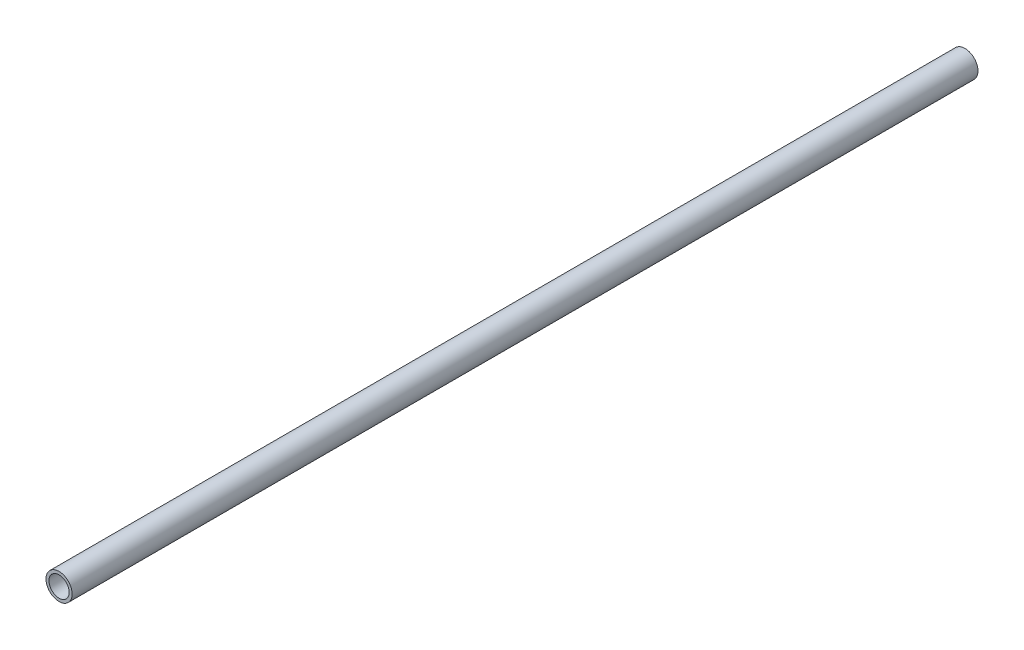
ISO-10303-21;
HEADER;
FILE_DESCRIPTION(('STEP AP214'),'2;1');
FILE_NAME('part.step','',(''),(''),'','','');
FILE_SCHEMA(('AUTOMOTIVE_DESIGN { 1 0 10303 214 1 1 1 1 }'));
ENDSEC;
DATA;
#1=APPLICATION_CONTEXT('core data for automotive mechanical design processes');
#2=APPLICATION_PROTOCOL_DEFINITION('international standard','automotive_design',2000,#1);
#3=PRODUCT_CONTEXT('',#1,'mechanical');
#4=PRODUCT('Part','Part','',(#3));
#5=PRODUCT_RELATED_PRODUCT_CATEGORY('part','',(#4));
#6=PRODUCT_DEFINITION_FORMATION('','',#4);
#7=PRODUCT_DEFINITION_CONTEXT('part definition',#1,'design');
#8=PRODUCT_DEFINITION('design','',#6,#7);
#9=PRODUCT_DEFINITION_SHAPE('','',#8);
#10=(LENGTH_UNIT() NAMED_UNIT(*) SI_UNIT(.MILLI.,.METRE.));
#11=(NAMED_UNIT(*) PLANE_ANGLE_UNIT() SI_UNIT($,.RADIAN.));
#12=(NAMED_UNIT(*) SI_UNIT($,.STERADIAN.) SOLID_ANGLE_UNIT());
#13=UNCERTAINTY_MEASURE_WITH_UNIT(LENGTH_MEASURE(1.E-05),#10,'distance_accuracy_value','');
#14=(GEOMETRIC_REPRESENTATION_CONTEXT(3) GLOBAL_UNCERTAINTY_ASSIGNED_CONTEXT((#13)) GLOBAL_UNIT_ASSIGNED_CONTEXT((#10,
#11,#12)) REPRESENTATION_CONTEXT('',''));
#15=CARTESIAN_POINT('',(0.,0.,0.));
#16=DIRECTION('',(0.,0.,1.));
#17=DIRECTION('',(1.,0.,0.));
#18=AXIS2_PLACEMENT_3D('',#15,#16,#17);
#19=CARTESIAN_POINT('',(0.,0.,165.1));
#20=DIRECTION('',(0.,0.,1.));
#21=DIRECTION('',(1.,0.,0.));
#22=AXIS2_PLACEMENT_3D('',#19,#20,#21);
#23=PLANE('',#22);
#24=CARTESIAN_POINT('',(0.,0.,165.1));
#25=DIRECTION('',(0.,0.,1.));
#26=DIRECTION('',(1.,0.,0.));
#27=AXIS2_PLACEMENT_3D('',#24,#25,#26);
#28=CIRCLE('',#27,4.7625);
#29=CARTESIAN_POINT('',(4.7625,0.,165.1));
#30=VERTEX_POINT('',#29);
#31=EDGE_CURVE('E10',#30,#30,#28,.T.);
#32=ORIENTED_EDGE('',*,*,#31,.T.);
#33=EDGE_LOOP('',(#32));
#34=FACE_BOUND('',#33,.T.);
#35=CARTESIAN_POINT('',(0.,0.,165.1));
#36=DIRECTION('',(0.,0.,1.));
#37=DIRECTION('',(1.,0.,0.));
#38=AXIS2_PLACEMENT_3D('',#35,#36,#37);
#39=CIRCLE('',#38,3.683);
#40=CARTESIAN_POINT('',(3.683,0.,165.1));
#41=VERTEX_POINT('',#40);
#42=EDGE_CURVE('E43',#41,#41,#39,.T.);
#43=ORIENTED_EDGE('',*,*,#42,.F.);
#44=EDGE_LOOP('',(#43));
#45=FACE_BOUND('',#44,.T.);
#46=ADVANCED_FACE('F32',(#34,#45),#23,.T.);
#47=CARTESIAN_POINT('',(0.,0.,-165.1));
#48=DIRECTION('',(0.,0.,1.));
#49=DIRECTION('',(1.,0.,0.));
#50=AXIS2_PLACEMENT_3D('',#47,#48,#49);
#51=PLANE('',#50);
#52=CARTESIAN_POINT('',(0.,0.,-165.1));
#53=DIRECTION('',(0.,0.,1.));
#54=DIRECTION('',(1.,0.,0.));
#55=AXIS2_PLACEMENT_3D('',#52,#53,#54);
#56=CIRCLE('',#55,4.7625);
#57=CARTESIAN_POINT('',(4.7625,0.,-165.1));
#58=VERTEX_POINT('',#57);
#59=EDGE_CURVE('E36',#58,#58,#56,.T.);
#60=ORIENTED_EDGE('',*,*,#59,.F.);
#61=EDGE_LOOP('',(#60));
#62=FACE_BOUND('',#61,.T.);
#63=CARTESIAN_POINT('',(0.,0.,-165.1));
#64=DIRECTION('',(0.,0.,1.));
#65=DIRECTION('',(1.,0.,0.));
#66=AXIS2_PLACEMENT_3D('',#63,#64,#65);
#67=CIRCLE('',#66,3.683);
#68=CARTESIAN_POINT('',(3.683,0.,-165.1));
#69=VERTEX_POINT('',#68);
#70=EDGE_CURVE('E45',#69,#69,#67,.T.);
#71=ORIENTED_EDGE('',*,*,#70,.T.);
#72=EDGE_LOOP('',(#71));
#73=FACE_BOUND('',#72,.T.);
#74=ADVANCED_FACE('F55',(#62,#73),#51,.F.);
#75=CARTESIAN_POINT('',(0.,0.,165.1));
#76=DIRECTION('',(0.,0.,-1.));
#77=DIRECTION('',(-1.,0.,0.));
#78=AXIS2_PLACEMENT_3D('',#75,#76,#77);
#79=CYLINDRICAL_SURFACE('',#78,4.7625);
#80=ORIENTED_EDGE('',*,*,#31,.F.);
#81=EDGE_LOOP('',(#80));
#82=FACE_BOUND('',#81,.T.);
#83=ORIENTED_EDGE('',*,*,#59,.T.);
#84=EDGE_LOOP('',(#83));
#85=FACE_BOUND('',#84,.T.);
#86=ADVANCED_FACE('F34',(#82,#85),#79,.T.);
#87=CARTESIAN_POINT('',(0.,0.,165.1));
#88=DIRECTION('',(0.,0.,-1.));
#89=DIRECTION('',(-1.,0.,0.));
#90=AXIS2_PLACEMENT_3D('',#87,#88,#89);
#91=CYLINDRICAL_SURFACE('',#90,3.683);
#92=ORIENTED_EDGE('',*,*,#42,.T.);
#93=EDGE_LOOP('',(#92));
#94=FACE_BOUND('',#93,.T.);
#95=ORIENTED_EDGE('',*,*,#70,.F.);
#96=EDGE_LOOP('',(#95));
#97=FACE_BOUND('',#96,.T.);
#98=ADVANCED_FACE('F51',(#94,#97),#91,.F.);
#99=CLOSED_SHELL('',(#46,#74,#86,#98));
#100=MANIFOLD_SOLID_BREP('B2',#99);
#101=ADVANCED_BREP_SHAPE_REPRESENTATION('',(#18,#100),#14);
#102=SHAPE_DEFINITION_REPRESENTATION(#9,#101);
ENDSEC;
END-ISO-10303-21;
